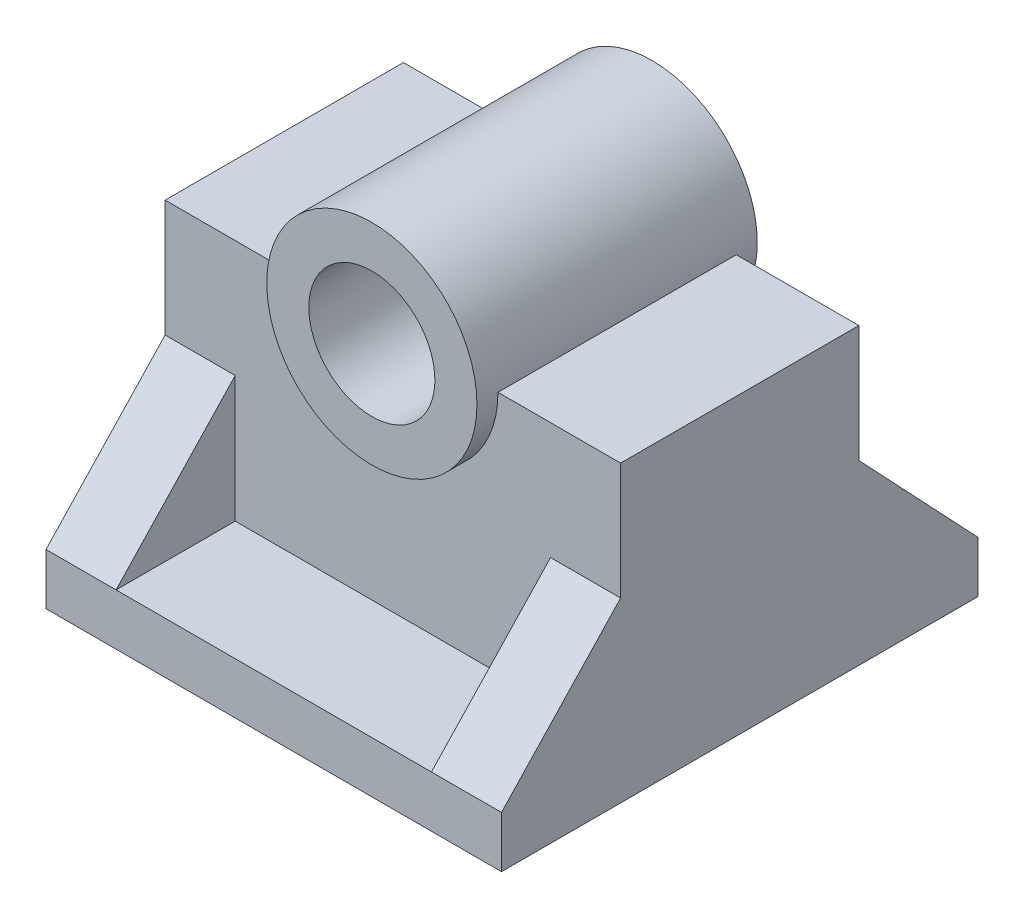
ISO-10303-21;
HEADER;
FILE_DESCRIPTION(('STEP AP214'),'2;1');
FILE_NAME('part.step','',(''),(''),'','','');
FILE_SCHEMA(('AUTOMOTIVE_DESIGN { 1 0 10303 214 1 1 1 1 }'));
ENDSEC;
DATA;
#1=APPLICATION_CONTEXT('core data for automotive mechanical design processes');
#2=APPLICATION_PROTOCOL_DEFINITION('international standard','automotive_design',2000,#1);
#3=PRODUCT_CONTEXT('',#1,'mechanical');
#4=PRODUCT('Part','Part','',(#3));
#5=PRODUCT_RELATED_PRODUCT_CATEGORY('part','',(#4));
#6=PRODUCT_DEFINITION_FORMATION('','',#4);
#7=PRODUCT_DEFINITION_CONTEXT('part definition',#1,'design');
#8=PRODUCT_DEFINITION('design','',#6,#7);
#9=PRODUCT_DEFINITION_SHAPE('','',#8);
#10=(LENGTH_UNIT() NAMED_UNIT(*) SI_UNIT(.MILLI.,.METRE.));
#11=(NAMED_UNIT(*) PLANE_ANGLE_UNIT() SI_UNIT($,.RADIAN.));
#12=(NAMED_UNIT(*) SI_UNIT($,.STERADIAN.) SOLID_ANGLE_UNIT());
#13=UNCERTAINTY_MEASURE_WITH_UNIT(LENGTH_MEASURE(1.E-05),#10,'distance_accuracy_value','');
#14=(GEOMETRIC_REPRESENTATION_CONTEXT(3) GLOBAL_UNCERTAINTY_ASSIGNED_CONTEXT((#13)) GLOBAL_UNIT_ASSIGNED_CONTEXT((#10,
#11,#12)) REPRESENTATION_CONTEXT('',''));
#15=CARTESIAN_POINT('',(0.,0.,0.));
#16=DIRECTION('',(0.,0.,1.));
#17=DIRECTION('',(1.,0.,0.));
#18=AXIS2_PLACEMENT_3D('',#15,#16,#17);
#19=CARTESIAN_POINT('',(-65.,32.0976430976431,-0.744107744107735));
#20=DIRECTION('',(0.,0.,-1.));
#21=DIRECTION('',(0.,1.,0.));
#22=AXIS2_PLACEMENT_3D('',#19,#20,#21);
#23=PLANE('',#22);
#24=DIRECTION('',(1.,0.,0.));
#25=VECTOR('',#24,1.);
#26=CARTESIAN_POINT('',(-65.,32.0976430976431,-0.744107744107735));
#27=LINE('',#26,#25);
#28=CARTESIAN_POINT('',(-65.,32.0976430976431,-0.744107744107735));
#29=VERTEX_POINT('',#28);
#30=CARTESIAN_POINT('',(-47.5,32.0976430976431,-0.744107744107735));
#31=VERTEX_POINT('',#30);
#32=EDGE_CURVE('E156',#29,#31,#27,.T.);
#33=ORIENTED_EDGE('',*,*,#32,.T.);
#34=CARTESIAN_POINT('',(-32.5,32.0976430976431,-0.744107744107735));
#35=DIRECTION('',(0.,0.,-1.));
#36=DIRECTION('',(0.,1.,0.));
#37=AXIS2_PLACEMENT_3D('',#34,#35,#36);
#38=CIRCLE('',#37,15.);
#39=CARTESIAN_POINT('',(-17.5,32.0976430976431,-0.744107744107735));
#40=VERTEX_POINT('',#39);
#41=EDGE_CURVE('E54',#40,#31,#38,.T.);
#42=ORIENTED_EDGE('',*,*,#41,.F.);
#43=CARTESIAN_POINT('',(0.,32.0976430976431,-0.744107744107735));
#44=VERTEX_POINT('',#43);
#45=EDGE_CURVE('E153',#40,#44,#27,.T.);
#46=ORIENTED_EDGE('',*,*,#45,.T.);
#47=DIRECTION('',(0.,1.,0.));
#48=VECTOR('',#47,1.);
#49=CARTESIAN_POINT('',(0.,32.0976430976431,-0.744107744107735));
#50=LINE('',#49,#48);
#51=CARTESIAN_POINT('',(0.,15.4242424242424,-0.744107744107737));
#52=VERTEX_POINT('',#51);
#53=EDGE_CURVE('E262',#52,#44,#50,.T.);
#54=ORIENTED_EDGE('',*,*,#53,.F.);
#55=DIRECTION('',(1.,0.,0.));
#56=VECTOR('',#55,1.);
#57=CARTESIAN_POINT('',(-10.,15.4242424242424,-0.744107744107737));
#58=LINE('',#57,#56);
#59=CARTESIAN_POINT('',(-10.,15.4242424242424,-0.744107744107737));
#60=VERTEX_POINT('',#59);
#61=EDGE_CURVE('E195',#60,#52,#58,.T.);
#62=ORIENTED_EDGE('',*,*,#61,.F.);
#63=DIRECTION('',(0.,-1.,0.));
#64=VECTOR('',#63,1.);
#65=CARTESIAN_POINT('',(-10.,-2.57575757575758,-0.744107744107739));
#66=LINE('',#65,#64);
#67=CARTESIAN_POINT('',(-10.,-2.57575757575758,-0.744107744107739));
#68=VERTEX_POINT('',#67);
#69=EDGE_CURVE('E183',#60,#68,#66,.T.);
#70=ORIENTED_EDGE('',*,*,#69,.T.);
#71=DIRECTION('',(1.,0.,0.));
#72=VECTOR('',#71,1.);
#73=CARTESIAN_POINT('',(-65.,-2.57575757575758,-0.744107744107739));
#74=LINE('',#73,#72);
#75=CARTESIAN_POINT('',(-55.,-2.57575757575758,-0.744107744107739));
#76=VERTEX_POINT('',#75);
#77=EDGE_CURVE('E168',#76,#68,#74,.T.);
#78=ORIENTED_EDGE('',*,*,#77,.F.);
#79=DIRECTION('',(0.,1.,0.));
#80=VECTOR('',#79,1.);
#81=CARTESIAN_POINT('',(-55.,15.4242424242424,-0.744107744107739));
#82=LINE('',#81,#80);
#83=CARTESIAN_POINT('',(-55.,15.4242424242424,-0.744107744107737));
#84=VERTEX_POINT('',#83);
#85=EDGE_CURVE('E62',#76,#84,#82,.T.);
#86=ORIENTED_EDGE('',*,*,#85,.T.);
#87=DIRECTION('',(-1.,0.,0.));
#88=VECTOR('',#87,1.);
#89=CARTESIAN_POINT('',(-55.,15.4242424242424,-0.744107744107739));
#90=LINE('',#89,#88);
#91=CARTESIAN_POINT('',(-65.,15.4242424242424,-0.744107744107739));
#92=VERTEX_POINT('',#91);
#93=EDGE_CURVE('E206',#84,#92,#90,.T.);
#94=ORIENTED_EDGE('',*,*,#93,.T.);
#95=DIRECTION('',(0.,1.,0.));
#96=VECTOR('',#95,1.);
#97=CARTESIAN_POINT('',(-65.,32.0976430976431,-0.744107744107735));
#98=LINE('',#97,#96);
#99=EDGE_CURVE('E247',#92,#29,#98,.T.);
#100=ORIENTED_EDGE('',*,*,#99,.T.);
#101=EDGE_LOOP('',(#33,#42,#46,#54,#62,#70,#78,#86,#94,#100));
#102=FACE_BOUND('',#101,.T.);
#103=ADVANCED_FACE('F37',(#102),#23,.T.);
#104=CARTESIAN_POINT('',(-65.,-2.57575757575758,33.2558922558923));
#105=DIRECTION('',(0.,0.,1.));
#106=DIRECTION('',(1.,0.,0.));
#107=AXIS2_PLACEMENT_3D('',#104,#105,#106);
#108=PLANE('',#107);
#109=DIRECTION('',(1.,0.,0.));
#110=VECTOR('',#109,1.);
#111=CARTESIAN_POINT('',(-65.,32.0976430976431,33.2558922558923));
#112=LINE('',#111,#110);
#113=CARTESIAN_POINT('',(-17.5,32.0976430976431,33.2558922558923));
#114=VERTEX_POINT('',#113);
#115=CARTESIAN_POINT('',(0.,32.0976430976431,33.2558922558923));
#116=VERTEX_POINT('',#115);
#117=EDGE_CURVE('E277',#114,#116,#112,.T.);
#118=ORIENTED_EDGE('',*,*,#117,.F.);
#119=CARTESIAN_POINT('',(-32.5,32.0976430976431,33.2558922558923));
#120=DIRECTION('',(0.,0.,1.));
#121=DIRECTION('',(1.,0.,0.));
#122=AXIS2_PLACEMENT_3D('',#119,#120,#121);
#123=CIRCLE('',#122,15.);
#124=CARTESIAN_POINT('',(-47.5,32.0976430976431,33.2558922558923));
#125=VERTEX_POINT('',#124);
#126=EDGE_CURVE('E173',#125,#114,#123,.T.);
#127=ORIENTED_EDGE('',*,*,#126,.F.);
#128=CARTESIAN_POINT('',(-65.,32.0976430976431,33.2558922558923));
#129=VERTEX_POINT('',#128);
#130=EDGE_CURVE('E275',#129,#125,#112,.T.);
#131=ORIENTED_EDGE('',*,*,#130,.F.);
#132=DIRECTION('',(0.,-1.,0.));
#133=VECTOR('',#132,1.);
#134=CARTESIAN_POINT('',(-65.,-2.57575757575758,33.2558922558923));
#135=LINE('',#134,#133);
#136=CARTESIAN_POINT('',(-65.,15.4242424242424,33.2558922558923));
#137=VERTEX_POINT('',#136);
#138=EDGE_CURVE('E252',#129,#137,#135,.T.);
#139=ORIENTED_EDGE('',*,*,#138,.T.);
#140=DIRECTION('',(-1.,0.,0.));
#141=VECTOR('',#140,1.);
#142=CARTESIAN_POINT('',(-55.,15.4242424242424,33.2558922558923));
#143=LINE('',#142,#141);
#144=CARTESIAN_POINT('',(-55.,15.4242424242424,33.2558922558923));
#145=VERTEX_POINT('',#144);
#146=EDGE_CURVE('E218',#145,#137,#143,.T.);
#147=ORIENTED_EDGE('',*,*,#146,.F.);
#148=DIRECTION('',(0.,-1.,0.));
#149=VECTOR('',#148,1.);
#150=CARTESIAN_POINT('',(-55.,-2.57575757575758,33.2558922558923));
#151=LINE('',#150,#149);
#152=CARTESIAN_POINT('',(-55.,-2.57575757575758,33.2558922558923));
#153=VERTEX_POINT('',#152);
#154=EDGE_CURVE('E211',#145,#153,#151,.T.);
#155=ORIENTED_EDGE('',*,*,#154,.T.);
#156=DIRECTION('',(1.,0.,0.));
#157=VECTOR('',#156,1.);
#158=CARTESIAN_POINT('',(-65.,-2.57575757575758,33.2558922558923));
#159=LINE('',#158,#157);
#160=CARTESIAN_POINT('',(-10.,-2.57575757575758,33.2558922558923));
#161=VERTEX_POINT('',#160);
#162=EDGE_CURVE('E273',#153,#161,#159,.T.);
#163=ORIENTED_EDGE('',*,*,#162,.T.);
#164=DIRECTION('',(0.,1.,0.));
#165=VECTOR('',#164,1.);
#166=CARTESIAN_POINT('',(-10.,-2.57575757575758,33.2558922558923));
#167=LINE('',#166,#165);
#168=CARTESIAN_POINT('',(-10.,15.4242424242424,33.2558922558923));
#169=VERTEX_POINT('',#168);
#170=EDGE_CURVE('E224',#161,#169,#167,.T.);
#171=ORIENTED_EDGE('',*,*,#170,.T.);
#172=DIRECTION('',(1.,0.,0.));
#173=VECTOR('',#172,1.);
#174=CARTESIAN_POINT('',(-10.,15.4242424242424,33.2558922558923));
#175=LINE('',#174,#173);
#176=CARTESIAN_POINT('',(0.,15.4242424242424,33.2558922558923));
#177=VERTEX_POINT('',#176);
#178=EDGE_CURVE('E233',#169,#177,#175,.T.);
#179=ORIENTED_EDGE('',*,*,#178,.T.);
#180=DIRECTION('',(0.,-1.,0.));
#181=VECTOR('',#180,1.);
#182=CARTESIAN_POINT('',(0.,-2.57575757575758,33.2558922558923));
#183=LINE('',#182,#181);
#184=EDGE_CURVE('E265',#116,#177,#183,.T.);
#185=ORIENTED_EDGE('',*,*,#184,.F.);
#186=EDGE_LOOP('',(#118,#127,#131,#139,#147,#155,#163,#171,#179,#185));
#187=FACE_BOUND('',#186,.T.);
#188=ADVANCED_FACE('F319',(#187),#108,.T.);
#189=CARTESIAN_POINT('',(-65.,32.0976430976431,33.2558922558923));
#190=DIRECTION('',(0.,1.,0.));
#191=DIRECTION('',(0.,0.,1.));
#192=AXIS2_PLACEMENT_3D('',#189,#190,#191);
#193=PLANE('',#192);
#194=DIRECTION('',(0.,0.,1.));
#195=VECTOR('',#194,1.);
#196=CARTESIAN_POINT('',(-47.5,32.0976430976431,-0.744107744107735));
#197=LINE('',#196,#195);
#198=EDGE_CURVE('E174',#31,#125,#197,.T.);
#199=ORIENTED_EDGE('',*,*,#198,.F.);
#200=ORIENTED_EDGE('',*,*,#32,.F.);
#201=DIRECTION('',(0.,0.,1.));
#202=VECTOR('',#201,1.);
#203=CARTESIAN_POINT('',(-65.,32.0976430976431,33.2558922558923));
#204=LINE('',#203,#202);
#205=EDGE_CURVE('E249',#29,#129,#204,.T.);
#206=ORIENTED_EDGE('',*,*,#205,.T.);
#207=ORIENTED_EDGE('',*,*,#130,.T.);
#208=EDGE_LOOP('',(#199,#200,#206,#207));
#209=FACE_BOUND('',#208,.T.);
#210=ADVANCED_FACE('F341',(#209),#193,.T.);
#211=CARTESIAN_POINT('',(-65.,-2.57575757575758,-0.744107744107739));
#212=DIRECTION('',(0.,1.,0.));
#213=DIRECTION('',(0.,0.,1.));
#214=AXIS2_PLACEMENT_3D('',#211,#212,#213);
#215=PLANE('',#214);
#216=ORIENTED_EDGE('',*,*,#77,.T.);
#217=DIRECTION('',(0.,0.,-1.));
#218=VECTOR('',#217,1.);
#219=CARTESIAN_POINT('',(-10.,-2.57575757575758,-17.7441077441077));
#220=LINE('',#219,#218);
#221=CARTESIAN_POINT('',(-10.,-2.57575757575758,-17.7441077441077));
#222=VERTEX_POINT('',#221);
#223=EDGE_CURVE('E186',#68,#222,#220,.T.);
#224=ORIENTED_EDGE('',*,*,#223,.T.);
#225=DIRECTION('',(1.,0.,0.));
#226=VECTOR('',#225,1.);
#227=CARTESIAN_POINT('',(-65.,-2.57575757575758,-17.7441077441077));
#228=LINE('',#227,#226);
#229=CARTESIAN_POINT('',(-55.,-2.57575757575758,-17.7441077441077));
#230=VERTEX_POINT('',#229);
#231=EDGE_CURVE('E282',#230,#222,#228,.T.);
#232=ORIENTED_EDGE('',*,*,#231,.F.);
#233=DIRECTION('',(0.,0.,1.));
#234=VECTOR('',#233,1.);
#235=CARTESIAN_POINT('',(-55.,-2.57575757575758,-0.744107744107739));
#236=LINE('',#235,#234);
#237=EDGE_CURVE('E200',#230,#76,#236,.T.);
#238=ORIENTED_EDGE('',*,*,#237,.T.);
#239=EDGE_LOOP('',(#216,#224,#232,#238));
#240=FACE_BOUND('',#239,.T.);
#241=ADVANCED_FACE('F310',(#240),#215,.T.);
#242=CARTESIAN_POINT('',(-65.,-2.57575757575758,50.2558922558923));
#243=DIRECTION('',(0.,1.,0.));
#244=DIRECTION('',(0.,0.,1.));
#245=AXIS2_PLACEMENT_3D('',#242,#243,#244);
#246=PLANE('',#245);
#247=ORIENTED_EDGE('',*,*,#162,.F.);
#248=DIRECTION('',(0.,0.,1.));
#249=VECTOR('',#248,1.);
#250=CARTESIAN_POINT('',(-55.,-2.57575757575758,50.2558922558923));
#251=LINE('',#250,#249);
#252=CARTESIAN_POINT('',(-55.,-2.57575757575758,50.2558922558923));
#253=VERTEX_POINT('',#252);
#254=EDGE_CURVE('E213',#153,#253,#251,.T.);
#255=ORIENTED_EDGE('',*,*,#254,.T.);
#256=DIRECTION('',(1.,0.,0.));
#257=VECTOR('',#256,1.);
#258=CARTESIAN_POINT('',(-65.,-2.57575757575758,50.2558922558923));
#259=LINE('',#258,#257);
#260=CARTESIAN_POINT('',(-10.,-2.57575757575758,50.2558922558923));
#261=VERTEX_POINT('',#260);
#262=EDGE_CURVE('E272',#253,#261,#259,.T.);
#263=ORIENTED_EDGE('',*,*,#262,.T.);
#264=DIRECTION('',(0.,0.,-1.));
#265=VECTOR('',#264,1.);
#266=CARTESIAN_POINT('',(-10.,-2.57575757575758,50.2558922558923));
#267=LINE('',#266,#265);
#268=EDGE_CURVE('E230',#261,#161,#267,.T.);
#269=ORIENTED_EDGE('',*,*,#268,.T.);
#270=EDGE_LOOP('',(#247,#255,#263,#269));
#271=FACE_BOUND('',#270,.T.);
#272=ADVANCED_FACE('F329',(#271),#246,.T.);
#273=CARTESIAN_POINT('',(-65.,-9.90235690235691,-17.7441077441077));
#274=DIRECTION('',(0.,-1.,0.));
#275=DIRECTION('',(0.,0.,-1.));
#276=AXIS2_PLACEMENT_3D('',#273,#274,#275);
#277=PLANE('',#276);
#278=DIRECTION('',(0.,0.,-1.));
#279=VECTOR('',#278,1.);
#280=CARTESIAN_POINT('',(0.,-9.90235690235691,-17.7441077441077));
#281=LINE('',#280,#279);
#282=CARTESIAN_POINT('',(0.,-9.90235690235691,50.2558922558923));
#283=VERTEX_POINT('',#282);
#284=CARTESIAN_POINT('',(0.,-9.90235690235691,-17.7441077441077));
#285=VERTEX_POINT('',#284);
#286=EDGE_CURVE('E238',#283,#285,#281,.T.);
#287=ORIENTED_EDGE('',*,*,#286,.F.);
#288=DIRECTION('',(1.,0.,0.));
#289=VECTOR('',#288,1.);
#290=CARTESIAN_POINT('',(-65.,-9.90235690235691,50.2558922558923));
#291=LINE('',#290,#289);
#292=CARTESIAN_POINT('',(-65.,-9.90235690235691,50.2558922558923));
#293=VERTEX_POINT('',#292);
#294=EDGE_CURVE('E11',#293,#283,#291,.T.);
#295=ORIENTED_EDGE('',*,*,#294,.F.);
#296=DIRECTION('',(0.,0.,-1.));
#297=VECTOR('',#296,1.);
#298=CARTESIAN_POINT('',(-65.,-9.90235690235691,-17.7441077441077));
#299=LINE('',#298,#297);
#300=CARTESIAN_POINT('',(-65.,-9.90235690235691,-17.7441077441077));
#301=VERTEX_POINT('',#300);
#302=EDGE_CURVE('E241',#293,#301,#299,.T.);
#303=ORIENTED_EDGE('',*,*,#302,.T.);
#304=DIRECTION('',(1.,0.,0.));
#305=VECTOR('',#304,1.);
#306=CARTESIAN_POINT('',(-65.,-9.90235690235691,-17.7441077441077));
#307=LINE('',#306,#305);
#308=EDGE_CURVE('E41',#301,#285,#307,.T.);
#309=ORIENTED_EDGE('',*,*,#308,.T.);
#310=EDGE_LOOP('',(#287,#295,#303,#309));
#311=FACE_BOUND('',#310,.T.);
#312=ADVANCED_FACE('F39',(#311),#277,.T.);
#313=CARTESIAN_POINT('',(-65.,-9.90235690235691,50.2558922558923));
#314=DIRECTION('',(0.,0.,1.));
#315=DIRECTION('',(1.,0.,0.));
#316=AXIS2_PLACEMENT_3D('',#313,#314,#315);
#317=PLANE('',#316);
#318=DIRECTION('',(0.,-1.,0.));
#319=VECTOR('',#318,1.);
#320=CARTESIAN_POINT('',(0.,-9.90235690235691,50.2558922558923));
#321=LINE('',#320,#319);
#322=CARTESIAN_POINT('',(0.,-2.57575757575758,50.2558922558923));
#323=VERTEX_POINT('',#322);
#324=EDGE_CURVE('E245',#323,#283,#321,.T.);
#325=ORIENTED_EDGE('',*,*,#324,.F.);
#326=DIRECTION('',(1.,0.,0.));
#327=VECTOR('',#326,1.);
#328=CARTESIAN_POINT('',(-10.,-2.57575757575758,50.2558922558923));
#329=LINE('',#328,#327);
#330=EDGE_CURVE('E235',#261,#323,#329,.T.);
#331=ORIENTED_EDGE('',*,*,#330,.F.);
#332=ORIENTED_EDGE('',*,*,#262,.F.);
#333=CARTESIAN_POINT('',(-65.,-2.57575757575758,50.2558922558923));
#334=VERTEX_POINT('',#333);
#335=EDGE_CURVE('E46',#334,#253,#259,.T.);
#336=ORIENTED_EDGE('',*,*,#335,.F.);
#337=DIRECTION('',(0.,-1.,0.));
#338=VECTOR('',#337,1.);
#339=CARTESIAN_POINT('',(-65.,-9.90235690235691,50.2558922558923));
#340=LINE('',#339,#338);
#341=EDGE_CURVE('E254',#334,#293,#340,.T.);
#342=ORIENTED_EDGE('',*,*,#341,.T.);
#343=ORIENTED_EDGE('',*,*,#294,.T.);
#344=EDGE_LOOP('',(#325,#331,#332,#336,#342,#343));
#345=FACE_BOUND('',#344,.T.);
#346=ADVANCED_FACE('F298',(#345),#317,.T.);
#347=DIRECTION('',(0.,0.,1.));
#348=VECTOR('',#347,1.);
#349=CARTESIAN_POINT('',(-17.5,32.0976430976431,-0.744107744107735));
#350=LINE('',#349,#348);
#351=EDGE_CURVE('E164',#114,#40,#350,.F.);
#352=ORIENTED_EDGE('',*,*,#351,.F.);
#353=ORIENTED_EDGE('',*,*,#117,.T.);
#354=DIRECTION('',(0.,0.,1.));
#355=VECTOR('',#354,1.);
#356=CARTESIAN_POINT('',(0.,32.0976430976431,33.2558922558923));
#357=LINE('',#356,#355);
#358=EDGE_CURVE('E167',#44,#116,#357,.T.);
#359=ORIENTED_EDGE('',*,*,#358,.F.);
#360=ORIENTED_EDGE('',*,*,#45,.F.);
#361=EDGE_LOOP('',(#352,#353,#359,#360));
#362=FACE_BOUND('',#361,.T.);
#363=ADVANCED_FACE('F163',(#362),#193,.T.);
#364=CARTESIAN_POINT('',(-65.,-2.57575757575758,-17.7441077441077));
#365=DIRECTION('',(0.,0.,-1.));
#366=DIRECTION('',(-1.,0.,0.));
#367=AXIS2_PLACEMENT_3D('',#364,#365,#366);
#368=PLANE('',#367);
#369=DIRECTION('',(0.,1.,0.));
#370=VECTOR('',#369,1.);
#371=CARTESIAN_POINT('',(0.,-2.57575757575758,-17.7441077441077));
#372=LINE('',#371,#370);
#373=CARTESIAN_POINT('',(0.,-2.57575757575758,-17.7441077441077));
#374=VERTEX_POINT('',#373);
#375=EDGE_CURVE('E259',#285,#374,#372,.T.);
#376=ORIENTED_EDGE('',*,*,#375,.F.);
#377=ORIENTED_EDGE('',*,*,#308,.F.);
#378=DIRECTION('',(0.,1.,0.));
#379=VECTOR('',#378,1.);
#380=CARTESIAN_POINT('',(-65.,-2.57575757575758,-17.7441077441077));
#381=LINE('',#380,#379);
#382=CARTESIAN_POINT('',(-65.,-2.57575757575758,-17.7441077441077));
#383=VERTEX_POINT('',#382);
#384=EDGE_CURVE('E244',#301,#383,#381,.T.);
#385=ORIENTED_EDGE('',*,*,#384,.T.);
#386=EDGE_CURVE('E280',#383,#230,#228,.T.);
#387=ORIENTED_EDGE('',*,*,#386,.T.);
#388=ORIENTED_EDGE('',*,*,#231,.T.);
#389=DIRECTION('',(1.,0.,0.));
#390=VECTOR('',#389,1.);
#391=CARTESIAN_POINT('',(-10.,-2.57575757575758,-17.7441077441077));
#392=LINE('',#391,#390);
#393=EDGE_CURVE('E192',#222,#374,#392,.T.);
#394=ORIENTED_EDGE('',*,*,#393,.T.);
#395=EDGE_LOOP('',(#376,#377,#385,#387,#388,#394));
#396=FACE_BOUND('',#395,.T.);
#397=ADVANCED_FACE('F292',(#396),#368,.T.);
#398=CARTESIAN_POINT('',(-65.,0.,0.));
#399=DIRECTION('',(-1.,0.,0.));
#400=DIRECTION('',(0.,0.,1.));
#401=AXIS2_PLACEMENT_3D('',#398,#399,#400);
#402=PLANE('',#401);
#403=ORIENTED_EDGE('',*,*,#302,.F.);
#404=ORIENTED_EDGE('',*,*,#341,.F.);
#405=DIRECTION('',(0.,0.727013152549817,-0.686623532963716));
#406=VECTOR('',#405,1.);
#407=CARTESIAN_POINT('',(-65.,15.4242424242424,33.2558922558923));
#408=LINE('',#407,#406);
#409=EDGE_CURVE('E210',#334,#137,#408,.T.);
#410=ORIENTED_EDGE('',*,*,#409,.T.);
#411=ORIENTED_EDGE('',*,*,#138,.F.);
#412=ORIENTED_EDGE('',*,*,#205,.F.);
#413=ORIENTED_EDGE('',*,*,#99,.F.);
#414=DIRECTION('',(0.,-0.727013152549818,-0.686623532963716));
#415=VECTOR('',#414,1.);
#416=CARTESIAN_POINT('',(-65.,-2.57575757575758,-17.7441077441077));
#417=LINE('',#416,#415);
#418=EDGE_CURVE('E197',#92,#383,#417,.T.);
#419=ORIENTED_EDGE('',*,*,#418,.T.);
#420=ORIENTED_EDGE('',*,*,#384,.F.);
#421=EDGE_LOOP('',(#403,#404,#410,#411,#412,#413,#419,#420));
#422=FACE_BOUND('',#421,.T.);
#423=ADVANCED_FACE('F302',(#422),#402,.T.);
#424=CARTESIAN_POINT('',(0.,0.,0.));
#425=DIRECTION('',(-1.,0.,0.));
#426=DIRECTION('',(0.,0.,1.));
#427=AXIS2_PLACEMENT_3D('',#424,#425,#426);
#428=PLANE('',#427);
#429=DIRECTION('',(0.,0.727013152549817,0.686623532963716));
#430=VECTOR('',#429,1.);
#431=CARTESIAN_POINT('',(0.,15.4242424242424,-0.744107744107737));
#432=LINE('',#431,#430);
#433=EDGE_CURVE('E177',#374,#52,#432,.T.);
#434=ORIENTED_EDGE('',*,*,#433,.T.);
#435=ORIENTED_EDGE('',*,*,#53,.T.);
#436=ORIENTED_EDGE('',*,*,#358,.T.);
#437=ORIENTED_EDGE('',*,*,#184,.T.);
#438=DIRECTION('',(0.,-0.727013152549817,0.686623532963716));
#439=VECTOR('',#438,1.);
#440=CARTESIAN_POINT('',(0.,15.4242424242424,33.2558922558923));
#441=LINE('',#440,#439);
#442=EDGE_CURVE('E223',#177,#323,#441,.T.);
#443=ORIENTED_EDGE('',*,*,#442,.T.);
#444=ORIENTED_EDGE('',*,*,#324,.T.);
#445=ORIENTED_EDGE('',*,*,#286,.T.);
#446=ORIENTED_EDGE('',*,*,#375,.T.);
#447=EDGE_LOOP('',(#434,#435,#436,#437,#443,#444,#445,#446));
#448=FACE_BOUND('',#447,.T.);
#449=ADVANCED_FACE('F294',(#448),#428,.F.);
#450=CARTESIAN_POINT('',(-10.,15.4242424242424,33.2558922558923));
#451=DIRECTION('',(0.,0.686623532963717,0.727013152549817));
#452=DIRECTION('',(0.,-0.727013152549817,0.686623532963717));
#453=AXIS2_PLACEMENT_3D('',#450,#451,#452);
#454=PLANE('',#453);
#455=ORIENTED_EDGE('',*,*,#442,.F.);
#456=ORIENTED_EDGE('',*,*,#178,.F.);
#457=DIRECTION('',(0.,-0.727013152549817,0.686623532963716));
#458=VECTOR('',#457,1.);
#459=CARTESIAN_POINT('',(-10.,15.4242424242424,33.2558922558923));
#460=LINE('',#459,#458);
#461=EDGE_CURVE('E227',#169,#261,#460,.T.);
#462=ORIENTED_EDGE('',*,*,#461,.T.);
#463=ORIENTED_EDGE('',*,*,#330,.T.);
#464=EDGE_LOOP('',(#455,#456,#462,#463));
#465=FACE_BOUND('',#464,.T.);
#466=ADVANCED_FACE('F323',(#465),#454,.T.);
#467=CARTESIAN_POINT('',(-10.,0.,0.));
#468=DIRECTION('',(-1.,0.,0.));
#469=DIRECTION('',(0.,0.,1.));
#470=AXIS2_PLACEMENT_3D('',#467,#468,#469);
#471=PLANE('',#470);
#472=ORIENTED_EDGE('',*,*,#170,.F.);
#473=ORIENTED_EDGE('',*,*,#268,.F.);
#474=ORIENTED_EDGE('',*,*,#461,.F.);
#475=EDGE_LOOP('',(#472,#473,#474));
#476=FACE_BOUND('',#475,.T.);
#477=ADVANCED_FACE('F326',(#476),#471,.T.);
#478=CARTESIAN_POINT('',(-55.,15.4242424242424,33.2558922558923));
#479=DIRECTION('',(0.,0.686623532963717,0.727013152549817));
#480=DIRECTION('',(0.,-0.727013152549817,0.686623532963717));
#481=AXIS2_PLACEMENT_3D('',#478,#479,#480);
#482=PLANE('',#481);
#483=ORIENTED_EDGE('',*,*,#409,.F.);
#484=ORIENTED_EDGE('',*,*,#335,.T.);
#485=DIRECTION('',(0.,0.727013152549817,-0.686623532963716));
#486=VECTOR('',#485,1.);
#487=CARTESIAN_POINT('',(-55.,15.4242424242424,33.2558922558923));
#488=LINE('',#487,#486);
#489=EDGE_CURVE('E215',#253,#145,#488,.T.);
#490=ORIENTED_EDGE('',*,*,#489,.T.);
#491=ORIENTED_EDGE('',*,*,#146,.T.);
#492=EDGE_LOOP('',(#483,#484,#490,#491));
#493=FACE_BOUND('',#492,.T.);
#494=ADVANCED_FACE('F334',(#493),#482,.T.);
#495=CARTESIAN_POINT('',(-55.,0.,0.));
#496=DIRECTION('',(-1.,0.,0.));
#497=DIRECTION('',(0.,0.,1.));
#498=AXIS2_PLACEMENT_3D('',#495,#496,#497);
#499=PLANE('',#498);
#500=ORIENTED_EDGE('',*,*,#154,.F.);
#501=ORIENTED_EDGE('',*,*,#489,.F.);
#502=ORIENTED_EDGE('',*,*,#254,.F.);
#503=EDGE_LOOP('',(#500,#501,#502));
#504=FACE_BOUND('',#503,.T.);
#505=ADVANCED_FACE('F337',(#504),#499,.F.);
#506=CARTESIAN_POINT('',(-55.,-2.57575757575758,-17.7441077441077));
#507=DIRECTION('',(0.,0.686623532963716,-0.727013152549818));
#508=DIRECTION('',(0.,0.727013152549818,0.686623532963716));
#509=AXIS2_PLACEMENT_3D('',#506,#507,#508);
#510=PLANE('',#509);
#511=ORIENTED_EDGE('',*,*,#418,.F.);
#512=ORIENTED_EDGE('',*,*,#93,.F.);
#513=DIRECTION('',(0.,-0.727013152549818,-0.686623532963716));
#514=VECTOR('',#513,1.);
#515=CARTESIAN_POINT('',(-55.,-2.57575757575758,-17.7441077441077));
#516=LINE('',#515,#514);
#517=EDGE_CURVE('E203',#84,#230,#516,.T.);
#518=ORIENTED_EDGE('',*,*,#517,.T.);
#519=ORIENTED_EDGE('',*,*,#386,.F.);
#520=EDGE_LOOP('',(#511,#512,#518,#519));
#521=FACE_BOUND('',#520,.T.);
#522=ADVANCED_FACE('F305',(#521),#510,.T.);
#523=CARTESIAN_POINT('',(-55.,0.,0.));
#524=DIRECTION('',(-1.,0.,0.));
#525=DIRECTION('',(0.,0.,1.));
#526=AXIS2_PLACEMENT_3D('',#523,#524,#525);
#527=PLANE('',#526);
#528=ORIENTED_EDGE('',*,*,#237,.F.);
#529=ORIENTED_EDGE('',*,*,#517,.F.);
#530=ORIENTED_EDGE('',*,*,#85,.F.);
#531=EDGE_LOOP('',(#528,#529,#530));
#532=FACE_BOUND('',#531,.T.);
#533=ADVANCED_FACE('F308',(#532),#527,.F.);
#534=CARTESIAN_POINT('',(-10.,15.4242424242424,-0.744107744107737));
#535=DIRECTION('',(0.,0.686623532963716,-0.727013152549817));
#536=DIRECTION('',(0.,0.727013152549817,0.686623532963717));
#537=AXIS2_PLACEMENT_3D('',#534,#535,#536);
#538=PLANE('',#537);
#539=ORIENTED_EDGE('',*,*,#433,.F.);
#540=ORIENTED_EDGE('',*,*,#393,.F.);
#541=DIRECTION('',(0.,0.727013152549817,0.686623532963716));
#542=VECTOR('',#541,1.);
#543=CARTESIAN_POINT('',(-10.,15.4242424242424,-0.744107744107737));
#544=LINE('',#543,#542);
#545=EDGE_CURVE('E189',#222,#60,#544,.T.);
#546=ORIENTED_EDGE('',*,*,#545,.T.);
#547=ORIENTED_EDGE('',*,*,#61,.T.);
#548=EDGE_LOOP('',(#539,#540,#546,#547));
#549=FACE_BOUND('',#548,.T.);
#550=ADVANCED_FACE('F316',(#549),#538,.T.);
#551=CARTESIAN_POINT('',(-10.,0.,0.));
#552=DIRECTION('',(1.,0.,0.));
#553=DIRECTION('',(0.,0.,-1.));
#554=AXIS2_PLACEMENT_3D('',#551,#552,#553);
#555=PLANE('',#554);
#556=ORIENTED_EDGE('',*,*,#69,.F.);
#557=ORIENTED_EDGE('',*,*,#545,.F.);
#558=ORIENTED_EDGE('',*,*,#223,.F.);
#559=EDGE_LOOP('',(#556,#557,#558));
#560=FACE_BOUND('',#559,.T.);
#561=ADVANCED_FACE('F314',(#560),#555,.F.);
#562=CARTESIAN_POINT('',(-32.5,32.0976430976431,-0.744107744107735));
#563=DIRECTION('',(0.,0.,1.));
#564=DIRECTION('',(1.,0.,0.));
#565=AXIS2_PLACEMENT_3D('',#562,#563,#564);
#566=CYLINDRICAL_SURFACE('',#565,15.);
#567=ORIENTED_EDGE('',*,*,#351,.T.);
#568=ORIENTED_EDGE('',*,*,#41,.T.);
#569=ORIENTED_EDGE('',*,*,#198,.T.);
#570=ORIENTED_EDGE('',*,*,#126,.T.);
#571=EDGE_LOOP('',(#567,#568,#569,#570));
#572=FACE_BOUND('',#571,.T.);
#573=CARTESIAN_POINT('',(-32.5,32.0976430976431,36.2558922558923));
#574=DIRECTION('',(0.,0.,1.));
#575=DIRECTION('',(1.,0.,0.));
#576=AXIS2_PLACEMENT_3D('',#573,#574,#575);
#577=CIRCLE('',#576,15.);
#578=CARTESIAN_POINT('',(-17.5,32.0976430976431,36.2558922558923));
#579=VERTEX_POINT('',#578);
#580=EDGE_CURVE('E175',#579,#579,#577,.T.);
#581=ORIENTED_EDGE('',*,*,#580,.F.);
#582=EDGE_LOOP('',(#581));
#583=FACE_BOUND('',#582,.T.);
#584=CARTESIAN_POINT('',(-32.5,32.0976430976431,-3.74410774410773));
#585=DIRECTION('',(0.,0.,-1.));
#586=DIRECTION('',(0.,1.,0.));
#587=AXIS2_PLACEMENT_3D('',#584,#585,#586);
#588=CIRCLE('',#587,15.);
#589=CARTESIAN_POINT('',(-32.5,47.0976430976431,-3.74410774410773));
#590=VERTEX_POINT('',#589);
#591=EDGE_CURVE('E157',#590,#590,#588,.T.);
#592=ORIENTED_EDGE('',*,*,#591,.F.);
#593=EDGE_LOOP('',(#592));
#594=FACE_BOUND('',#593,.T.);
#595=ADVANCED_FACE('F170',(#572,#583,#594),#566,.T.);
#596=CARTESIAN_POINT('',(-32.5,32.0976430976431,36.2558922558923));
#597=DIRECTION('',(0.,0.,1.));
#598=DIRECTION('',(1.,0.,0.));
#599=AXIS2_PLACEMENT_3D('',#596,#597,#598);
#600=PLANE('',#599);
#601=CARTESIAN_POINT('',(-32.5,32.0976430976431,36.2558922558923));
#602=DIRECTION('',(0.,0.,1.));
#603=DIRECTION('',(1.,0.,0.));
#604=AXIS2_PLACEMENT_3D('',#601,#602,#603);
#605=CIRCLE('',#604,9.);
#606=CARTESIAN_POINT('',(-32.5,41.0976430976431,36.2558922558923));
#607=VERTEX_POINT('',#606);
#608=EDGE_CURVE('E347',#607,#607,#605,.F.);
#609=ORIENTED_EDGE('',*,*,#608,.T.);
#610=EDGE_LOOP('',(#609));
#611=FACE_BOUND('',#610,.T.);
#612=ORIENTED_EDGE('',*,*,#580,.T.);
#613=EDGE_LOOP('',(#612));
#614=FACE_BOUND('',#613,.T.);
#615=ADVANCED_FACE('F357',(#611,#614),#600,.T.);
#616=CARTESIAN_POINT('',(-32.5,32.0976430976431,-3.74410774410773));
#617=DIRECTION('',(0.,0.,-1.));
#618=DIRECTION('',(0.,1.,0.));
#619=AXIS2_PLACEMENT_3D('',#616,#617,#618);
#620=PLANE('',#619);
#621=CARTESIAN_POINT('',(-32.5,32.0976430976431,-3.74410774410773));
#622=DIRECTION('',(0.,0.,-1.));
#623=DIRECTION('',(0.,1.,0.));
#624=AXIS2_PLACEMENT_3D('',#621,#622,#623);
#625=CIRCLE('',#624,9.);
#626=CARTESIAN_POINT('',(-32.5,41.0976430976431,-3.74410774410773));
#627=VERTEX_POINT('',#626);
#628=EDGE_CURVE('E158',#627,#627,#625,.T.);
#629=ORIENTED_EDGE('',*,*,#628,.F.);
#630=EDGE_LOOP('',(#629));
#631=FACE_BOUND('',#630,.T.);
#632=ORIENTED_EDGE('',*,*,#591,.T.);
#633=EDGE_LOOP('',(#632));
#634=FACE_BOUND('',#633,.T.);
#635=ADVANCED_FACE('F355',(#631,#634),#620,.T.);
#636=CARTESIAN_POINT('',(-32.5,32.0976430976431,50.2568922558923));
#637=DIRECTION('',(0.,0.,-1.));
#638=DIRECTION('',(0.,1.,0.));
#639=AXIS2_PLACEMENT_3D('',#636,#637,#638);
#640=CYLINDRICAL_SURFACE('',#639,9.);
#641=CARTESIAN_POINT('',(-32.5,41.0976430976431,36.2558922558923));
#642=CARTESIAN_POINT('',(-32.5,41.0976430976431,35.8392255892256));
#643=CARTESIAN_POINT('',(-32.5,41.0976430976431,35.4225589225589));
#644=CARTESIAN_POINT('',(-32.5,41.0976430976431,34.5892255892256));
#645=CARTESIAN_POINT('',(-32.5,41.0976430976431,34.1725589225589));
#646=CARTESIAN_POINT('',(-32.5,41.0976430976431,33.3392255892256));
#647=CARTESIAN_POINT('',(-32.5,41.0976430976431,32.9225589225589));
#648=CARTESIAN_POINT('',(-32.5,41.0976430976431,32.0892255892256));
#649=CARTESIAN_POINT('',(-32.5,41.0976430976431,31.6725589225589));
#650=CARTESIAN_POINT('',(-32.5,41.0976430976431,30.8392255892256));
#651=CARTESIAN_POINT('',(-32.5,41.0976430976431,30.4225589225589));
#652=CARTESIAN_POINT('',(-32.5,41.0976430976431,29.5892255892256));
#653=CARTESIAN_POINT('',(-32.5,41.0976430976431,29.1725589225589));
#654=CARTESIAN_POINT('',(-32.5,41.0976430976431,28.3392255892256));
#655=CARTESIAN_POINT('',(-32.5,41.0976430976431,27.9225589225589));
#656=CARTESIAN_POINT('',(-32.5,41.0976430976431,27.0892255892256));
#657=CARTESIAN_POINT('',(-32.5,41.0976430976431,26.6725589225589));
#658=CARTESIAN_POINT('',(-32.5,41.0976430976431,25.8392255892256));
#659=CARTESIAN_POINT('',(-32.5,41.0976430976431,25.4225589225589));
#660=CARTESIAN_POINT('',(-32.5,41.0976430976431,24.5892255892256));
#661=CARTESIAN_POINT('',(-32.5,41.0976430976431,24.1725589225589));
#662=CARTESIAN_POINT('',(-32.5,41.0976430976431,23.3392255892256));
#663=CARTESIAN_POINT('',(-32.5,41.0976430976431,22.9225589225589));
#664=CARTESIAN_POINT('',(-32.5,41.0976430976431,22.0892255892256));
#665=CARTESIAN_POINT('',(-32.5,41.0976430976431,21.6725589225589));
#666=CARTESIAN_POINT('',(-32.5,41.0976430976431,20.8392255892256));
#667=CARTESIAN_POINT('',(-32.5,41.0976430976431,20.4225589225589));
#668=CARTESIAN_POINT('',(-32.5,41.0976430976431,19.5892255892256));
#669=CARTESIAN_POINT('',(-32.5,41.0976430976431,19.1725589225589));
#670=CARTESIAN_POINT('',(-32.5,41.0976430976431,18.3392255892256));
#671=CARTESIAN_POINT('',(-32.5,41.0976430976431,17.9225589225589));
#672=CARTESIAN_POINT('',(-32.5,41.0976430976431,17.0892255892256));
#673=CARTESIAN_POINT('',(-32.5,41.0976430976431,16.6725589225589));
#674=CARTESIAN_POINT('',(-32.5,41.0976430976431,15.8392255892256));
#675=CARTESIAN_POINT('',(-32.5,41.0976430976431,15.4225589225589));
#676=CARTESIAN_POINT('',(-32.5,41.0976430976431,14.5892255892256));
#677=CARTESIAN_POINT('',(-32.5,41.0976430976431,14.1725589225589));
#678=CARTESIAN_POINT('',(-32.5,41.0976430976431,13.3392255892256));
#679=CARTESIAN_POINT('',(-32.5,41.0976430976431,12.9225589225589));
#680=CARTESIAN_POINT('',(-32.5,41.0976430976431,12.0892255892256));
#681=CARTESIAN_POINT('',(-32.5,41.0976430976431,11.6725589225589));
#682=CARTESIAN_POINT('',(-32.5,41.0976430976431,10.8392255892256));
#683=CARTESIAN_POINT('',(-32.5,41.0976430976431,10.4225589225589));
#684=CARTESIAN_POINT('',(-32.5,41.0976430976431,9.5892255892256));
#685=CARTESIAN_POINT('',(-32.5,41.0976430976431,9.17255892255893));
#686=CARTESIAN_POINT('',(-32.5,41.0976430976431,8.3392255892256));
#687=CARTESIAN_POINT('',(-32.5,41.0976430976431,7.92255892255893));
#688=CARTESIAN_POINT('',(-32.5,41.0976430976431,7.0892255892256));
#689=CARTESIAN_POINT('',(-32.5,41.0976430976431,6.67255892255893));
#690=CARTESIAN_POINT('',(-32.5,41.0976430976431,5.8392255892256));
#691=CARTESIAN_POINT('',(-32.5,41.0976430976431,5.42255892255893));
#692=CARTESIAN_POINT('',(-32.5,41.0976430976431,4.5892255892256));
#693=CARTESIAN_POINT('',(-32.5,41.0976430976431,4.17255892255893));
#694=CARTESIAN_POINT('',(-32.5,41.0976430976431,3.3392255892256));
#695=CARTESIAN_POINT('',(-32.5,41.0976430976431,2.92255892255893));
#696=CARTESIAN_POINT('',(-32.5,41.0976430976431,2.0892255892256));
#697=CARTESIAN_POINT('',(-32.5,41.0976430976431,1.67255892255894));
#698=CARTESIAN_POINT('',(-32.5,41.0976430976431,0.839225589225607));
#699=CARTESIAN_POINT('',(-32.5,41.0976430976431,0.42255892255894));
#700=CARTESIAN_POINT('',(-32.5,41.0976430976431,-0.410774410774394));
#701=CARTESIAN_POINT('',(-32.5,41.0976430976431,-0.827441077441061));
#702=CARTESIAN_POINT('',(-32.5,41.0976430976431,-1.6607744107744));
#703=CARTESIAN_POINT('',(-32.5,41.0976430976431,-2.07744107744106));
#704=CARTESIAN_POINT('',(-32.5,41.0976430976431,-2.9107744107744));
#705=CARTESIAN_POINT('',(-32.5,41.0976430976431,-3.32744107744106));
#706=CARTESIAN_POINT('',(-32.5,41.0976430976431,-3.74410774410773));
#707=B_SPLINE_CURVE_WITH_KNOTS('',3,(#641,#642,#643,#644,#645,#646,#647,#648,#649,#650,#651,
#652,#653,#654,#655,#656,#657,#658,#659,#660,#661,#662,#663,#664,#665,#666,#667,#668,#669,#670,
#671,#672,#673,#674,#675,#676,#677,#678,#679,#680,#681,#682,#683,#684,#685,#686,#687,#688,#689,
#690,#691,#692,#693,#694,#695,#696,#697,#698,#699,#700,#701,#702,#703,#704,#705,#706),
.UNSPECIFIED.,.F.,.F.,(4,2,2,2,2,2,2,2,2,2,2,2,2,2,2,2,2,2,2,2,2,2,2,2,2,2,2,2,2,2,2,2,4),(0.,
1.25,2.5,3.75,5.,6.25,7.5,8.75,10.,11.25,12.5,13.75,15.,16.25,17.5,18.75,20.,21.25,22.5,23.75,
25.,26.25,27.5,28.75,30.,31.25,32.5,33.75,35.,36.25,37.5,38.75,40.),.UNSPECIFIED.);
#708=EDGE_CURVE('BSEAM353',#607,#627,#707,.T.);
#709=ORIENTED_EDGE('',*,*,#608,.F.);
#710=ORIENTED_EDGE('',*,*,#628,.T.);
#711=ORIENTED_EDGE('',*,*,#708,.T.);
#712=ORIENTED_EDGE('',*,*,#708,.F.);
#713=EDGE_LOOP('',(#709,#711,#710,#712));
#714=FACE_BOUND('',#713,.T.);
#715=ADVANCED_FACE('F353',(#714),#640,.F.);
#716=CLOSED_SHELL('',(#103,#188,#210,#241,#272,#312,#346,#363,#397,#423,#449,#466,#477,#494,
#505,#522,#533,#550,#561,#595,#615,#635,#715));
#717=MANIFOLD_SOLID_BREP('B2',#716);
#718=ADVANCED_BREP_SHAPE_REPRESENTATION('',(#18,#717),#14);
#719=SHAPE_DEFINITION_REPRESENTATION(#9,#718);
ENDSEC;
END-ISO-10303-21;
